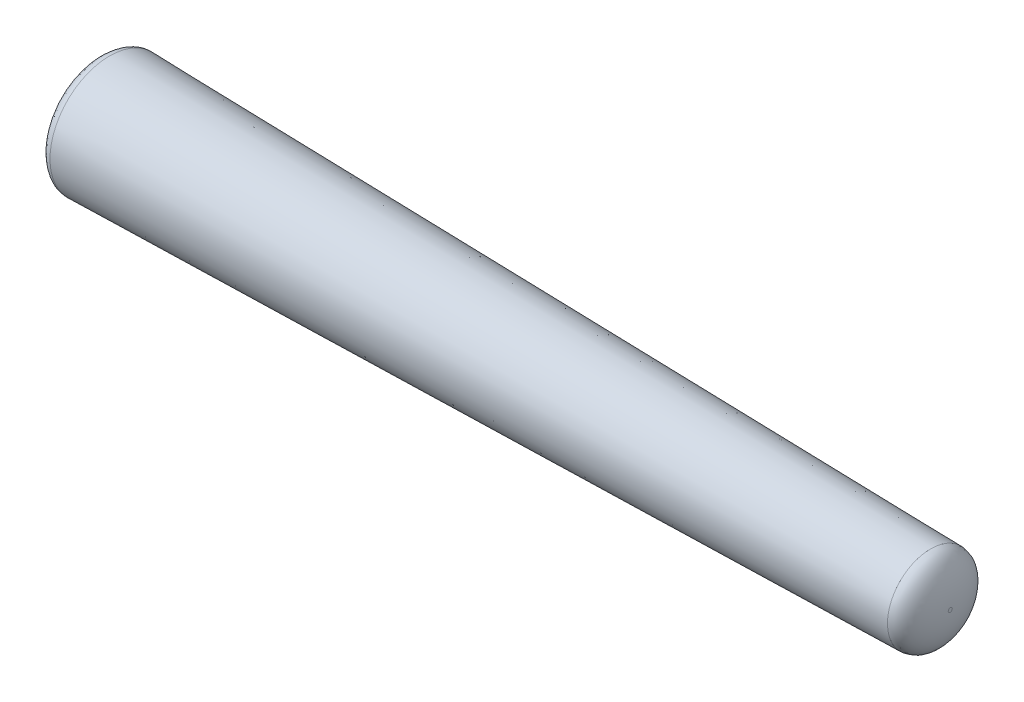
ISO-10303-21;
HEADER;
FILE_DESCRIPTION(('STEP AP214'),'2;1');
FILE_NAME('part.step','',(''),(''),'','','');
FILE_SCHEMA(('AUTOMOTIVE_DESIGN { 1 0 10303 214 1 1 1 1 }'));
ENDSEC;
DATA;
#1=APPLICATION_CONTEXT('core data for automotive mechanical design processes');
#2=APPLICATION_PROTOCOL_DEFINITION('international standard','automotive_design',2000,#1);
#3=PRODUCT_CONTEXT('',#1,'mechanical');
#4=PRODUCT('Part','Part','',(#3));
#5=PRODUCT_RELATED_PRODUCT_CATEGORY('part','',(#4));
#6=PRODUCT_DEFINITION_FORMATION('','',#4);
#7=PRODUCT_DEFINITION_CONTEXT('part definition',#1,'design');
#8=PRODUCT_DEFINITION('design','',#6,#7);
#9=PRODUCT_DEFINITION_SHAPE('','',#8);
#10=(LENGTH_UNIT() NAMED_UNIT(*) SI_UNIT(.MILLI.,.METRE.));
#11=(NAMED_UNIT(*) PLANE_ANGLE_UNIT() SI_UNIT($,.RADIAN.));
#12=(NAMED_UNIT(*) SI_UNIT($,.STERADIAN.) SOLID_ANGLE_UNIT());
#13=UNCERTAINTY_MEASURE_WITH_UNIT(LENGTH_MEASURE(1.E-05),#10,'distance_accuracy_value','');
#14=(GEOMETRIC_REPRESENTATION_CONTEXT(3) GLOBAL_UNCERTAINTY_ASSIGNED_CONTEXT((#13)) GLOBAL_UNIT_ASSIGNED_CONTEXT((#10,
#11,#12)) REPRESENTATION_CONTEXT('',''));
#15=CARTESIAN_POINT('',(0.,0.,0.));
#16=DIRECTION('',(0.,0.,1.));
#17=DIRECTION('',(1.,0.,0.));
#18=AXIS2_PLACEMENT_3D('',#15,#16,#17);
#19=CARTESIAN_POINT('',(0.,0.,0.));
#20=DIRECTION('',(-1.,0.,0.));
#21=DIRECTION('',(0.,0.,-1.));
#22=AXIS2_PLACEMENT_3D('',#19,#20,#21);
#23=CONICAL_SURFACE('',#22,2.5,0.0200712863979348);
#24=CARTESIAN_POINT('',(20.0401398775672,0.,-2.09771459050936));
#25=CARTESIAN_POINT('',(20.0401398775672,0.274585444005414,-2.09771459050936));
#26=CARTESIAN_POINT('',(20.0401398775672,0.549076747976326,-2.04311487541138));
#27=CARTESIAN_POINT('',(20.0401398775672,1.05644449126058,-1.83295627503241));
#28=CARTESIAN_POINT('',(20.0401398775672,1.28914698247178,-1.67746944141448));
#29=CARTESIAN_POINT('',(20.0401398775672,1.67746944141448,-1.28914698247178));
#30=CARTESIAN_POINT('',(20.0401398775672,1.83295627503241,-1.05644449126058));
#31=CARTESIAN_POINT('',(20.0401398775672,2.04311487541138,-0.549076747976324));
#32=CARTESIAN_POINT('',(20.0401398775672,2.09771459050936,-0.274585444005414));
#33=CARTESIAN_POINT('',(20.0401398775672,2.09771459050936,0.274585444005414));
#34=CARTESIAN_POINT('',(20.0401398775672,2.04311487541138,0.549076747976327));
#35=CARTESIAN_POINT('',(20.0401398775672,1.83295627503241,1.05644449126058));
#36=CARTESIAN_POINT('',(20.0401398775672,1.67746944141448,1.28914698247179));
#37=CARTESIAN_POINT('',(20.0401398775672,1.28914698247178,1.67746944141448));
#38=CARTESIAN_POINT('',(20.0401398775672,1.05644449126058,1.83295627503241));
#39=CARTESIAN_POINT('',(20.0401398775672,0.549076747976328,2.04311487541138));
#40=CARTESIAN_POINT('',(20.0401398775672,0.274585444005414,2.09771459050936));
#41=CARTESIAN_POINT('',(20.0401398775672,-0.274585444005414,2.09771459050936));
#42=CARTESIAN_POINT('',(20.0401398775672,-0.549076747976324,2.04311487541138));
#43=CARTESIAN_POINT('',(20.0401398775672,-1.05644449126057,1.83295627503241));
#44=CARTESIAN_POINT('',(20.0401398775672,-1.28914698247179,1.67746944141448));
#45=CARTESIAN_POINT('',(20.0401398775672,-1.67746944141448,1.28914698247178));
#46=CARTESIAN_POINT('',(20.0401398775672,-1.83295627503241,1.05644449126058));
#47=CARTESIAN_POINT('',(20.0401398775672,-2.04311487541138,0.54907674797633));
#48=CARTESIAN_POINT('',(20.0401398775672,-2.09771459050936,0.274585444005411));
#49=CARTESIAN_POINT('',(20.0401398775672,-2.09771459050936,-0.274585444005418));
#50=CARTESIAN_POINT('',(20.0401398775672,-2.04311487541138,-0.549076747976322));
#51=CARTESIAN_POINT('',(20.0401398775672,-1.83295627503241,-1.05644449126057));
#52=CARTESIAN_POINT('',(20.0401398775672,-1.67746944141448,-1.28914698247178));
#53=CARTESIAN_POINT('',(20.0401398775672,-1.28914698247179,-1.67746944141447));
#54=CARTESIAN_POINT('',(20.0401398775672,-1.05644449126058,-1.83295627503241));
#55=CARTESIAN_POINT('',(20.0401398775672,-0.549076747976329,-2.04311487541138));
#56=CARTESIAN_POINT('',(20.0401398775672,-0.274585444005414,-2.09771459050936));
#57=CARTESIAN_POINT('',(20.0401398775672,0.,-2.09771459050936));
#58=(BOUNDED_CURVE() B_SPLINE_CURVE(3,(#24,#25,#26,#27,#28,#29,#30,#31,#32,#33,#34,#35,#36,#37,
#38,#39,#40,#41,#42,#43,#44,#45,#46,#47,#48,#49,#50,#51,#52,#53,#54,#55,#56,#57),.UNSPECIFIED.,
.T.,.F.) B_SPLINE_CURVE_WITH_KNOTS((4,2,2,2,2,2,2,2,2,2,2,2,2,2,2,2,4),(0.,0.392699081698724,
0.785398163397448,1.17809724509617,1.5707963267949,1.96349540849362,2.35619449019234,
2.74889357189107,3.14159265358979,3.53429173528852,3.92699081698724,4.31968989868597,
4.71238898038469,5.10508806208341,5.49778714378214,5.89048622548086,6.28318530717959),
.UNSPECIFIED.) CURVE() GEOMETRIC_REPRESENTATION_ITEM() RATIONAL_B_SPLINE_CURVE((1.,1.,1.,1.,1.,
1.,1.,1.,1.,1.,1.,1.,1.,1.,1.,1.,1.,1.,1.,1.,1.,1.,1.,1.,1.,1.,1.,1.,1.,1.,1.,1.,1.,1.)) REPRESENTATION_ITEM(''));
#59=CARTESIAN_POINT('',(20.0401398775672,0.,-2.09771459050936));
#60=VERTEX_POINT('',#59);
#61=EDGE_CURVE('E11',#60,#60,#58,.F.);
#62=ORIENTED_EDGE('',*,*,#61,.T.);
#63=EDGE_LOOP('',(#62));
#64=FACE_BOUND('',#63,.T.);
#65=CARTESIAN_POINT('',(-19.943804171406,0.,-2.90035156824809));
#66=CARTESIAN_POINT('',(-19.943804171406,-0.379648919222035,-2.90035156824809));
#67=CARTESIAN_POINT('',(-19.943804171406,-0.759166627193389,-2.82486080249301));
#68=CARTESIAN_POINT('',(-19.943804171406,-1.46066635921192,-2.53429009948984));
#69=CARTESIAN_POINT('',(-19.943804171406,-1.78240593648123,-2.3193105869853));
#70=CARTESIAN_POINT('',(-19.943804171406,-2.31931058698531,-1.78240593648122));
#71=CARTESIAN_POINT('',(-19.943804171406,-2.53429009948984,-1.46066635921191));
#72=CARTESIAN_POINT('',(-19.943804171406,-2.82486080249301,-0.759166627193382));
#73=CARTESIAN_POINT('',(-19.943804171406,-2.90035156824809,-0.379648919222035));
#74=CARTESIAN_POINT('',(-19.943804171406,-2.90035156824809,0.379648919222026));
#75=CARTESIAN_POINT('',(-19.943804171406,-2.82486080249301,0.75916662719339));
#76=CARTESIAN_POINT('',(-19.943804171406,-2.53429009948984,1.46066635921192));
#77=CARTESIAN_POINT('',(-19.943804171406,-2.3193105869853,1.78240593648122));
#78=CARTESIAN_POINT('',(-19.943804171406,-1.78240593648123,2.3193105869853));
#79=CARTESIAN_POINT('',(-19.943804171406,-1.46066635921191,2.53429009948984));
#80=CARTESIAN_POINT('',(-19.943804171406,-0.759166627193381,2.82486080249301));
#81=CARTESIAN_POINT('',(-19.943804171406,-0.37964891922203,2.90035156824809));
#82=CARTESIAN_POINT('',(-19.943804171406,0.37964891922203,2.90035156824809));
#83=CARTESIAN_POINT('',(-19.943804171406,0.759166627193389,2.82486080249301));
#84=CARTESIAN_POINT('',(-19.943804171406,1.46066635921192,2.53429009948984));
#85=CARTESIAN_POINT('',(-19.943804171406,1.78240593648122,2.3193105869853));
#86=CARTESIAN_POINT('',(-19.943804171406,2.3193105869853,1.78240593648123));
#87=CARTESIAN_POINT('',(-19.943804171406,2.53429009948984,1.46066635921192));
#88=CARTESIAN_POINT('',(-19.943804171406,2.82486080249301,0.759166627193388));
#89=CARTESIAN_POINT('',(-19.943804171406,2.90035156824809,0.37964891922203));
#90=CARTESIAN_POINT('',(-19.943804171406,2.90035156824809,-0.37964891922203));
#91=CARTESIAN_POINT('',(-19.943804171406,2.82486080249301,-0.759166627193384));
#92=CARTESIAN_POINT('',(-19.943804171406,2.53429009948984,-1.46066635921191));
#93=CARTESIAN_POINT('',(-19.943804171406,2.31931058698531,-1.78240593648122));
#94=CARTESIAN_POINT('',(-19.943804171406,1.78240593648122,-2.31931058698531));
#95=CARTESIAN_POINT('',(-19.943804171406,1.46066635921192,-2.53429009948984));
#96=CARTESIAN_POINT('',(-19.943804171406,0.759166627193385,-2.82486080249301));
#97=CARTESIAN_POINT('',(-19.943804171406,0.379648919222035,-2.90035156824809));
#98=CARTESIAN_POINT('',(-19.943804171406,0.,-2.90035156824809));
#99=(BOUNDED_CURVE() B_SPLINE_CURVE(3,(#65,#66,#67,#68,#69,#70,#71,#72,#73,#74,#75,#76,#77,#78,
#79,#80,#81,#82,#83,#84,#85,#86,#87,#88,#89,#90,#91,#92,#93,#94,#95,#96,#97,#98),.UNSPECIFIED.,
.T.,.F.) B_SPLINE_CURVE_WITH_KNOTS((4,2,2,2,2,2,2,2,2,2,2,2,2,2,2,2,4),(0.,0.392699081698725,
0.785398163397448,1.17809724509617,1.5707963267949,1.96349540849362,2.35619449019234,
2.74889357189107,3.14159265358979,3.53429173528852,3.92699081698724,4.31968989868597,
4.71238898038469,5.10508806208341,5.49778714378214,5.89048622548086,6.28318530717959),
.UNSPECIFIED.) CURVE() GEOMETRIC_REPRESENTATION_ITEM() RATIONAL_B_SPLINE_CURVE((1.,1.,1.,1.,1.,
1.,1.,1.,1.,1.,1.,1.,1.,1.,1.,1.,1.,1.,1.,1.,1.,1.,1.,1.,1.,1.,1.,1.,1.,1.,1.,1.,1.,1.)) REPRESENTATION_ITEM(''));
#100=CARTESIAN_POINT('',(-19.943804171406,0.,-2.90035156824809));
#101=VERTEX_POINT('',#100);
#102=EDGE_CURVE('E59',#101,#101,#99,.F.);
#103=ORIENTED_EDGE('',*,*,#102,.T.);
#104=EDGE_LOOP('',(#103));
#105=FACE_BOUND('',#104,.T.);
#106=ADVANCED_FACE('F36',(#64,#105),#23,.T.);
#107=CARTESIAN_POINT('',(-21.,0.,0.));
#108=DIRECTION('',(1.,0.,0.));
#109=DIRECTION('',(0.,0.,-1.));
#110=AXIS2_PLACEMENT_3D('',#107,#108,#109);
#111=PLANE('',#110);
#112=CARTESIAN_POINT('',(-21.,0.,-0.100915548466853));
#113=CARTESIAN_POINT('',(-21.,0.0132095982182193,-0.100915548466853));
#114=CARTESIAN_POINT('',(-21.,0.0264146310397905,-0.0982889041269878));
#115=CARTESIAN_POINT('',(-21.,0.050822785892811,-0.0881787153543641));
#116=CARTESIAN_POINT('',(-21.,0.0620174721712188,-0.0806986651249236));
#117=CARTESIAN_POINT('',(-21.,0.0806986651249236,-0.0620174721712188));
#118=CARTESIAN_POINT('',(-21.,0.0881787153543641,-0.0508227858928109));
#119=CARTESIAN_POINT('',(-21.,0.0982889041269878,-0.0264146310397905));
#120=CARTESIAN_POINT('',(-21.,0.100915548466853,-0.0132095982182191));
#121=CARTESIAN_POINT('',(-21.,0.100915548466853,0.0132095982182191));
#122=CARTESIAN_POINT('',(-21.,0.0982889041269878,0.0264146310397906));
#123=CARTESIAN_POINT('',(-21.,0.0881787153543641,0.0508227858928109));
#124=CARTESIAN_POINT('',(-21.,0.0806986651249236,0.0620174721712189));
#125=CARTESIAN_POINT('',(-21.,0.0620174721712187,0.0806986651249236));
#126=CARTESIAN_POINT('',(-21.,0.0508227858928111,0.088178715354364));
#127=CARTESIAN_POINT('',(-21.,0.0264146310397907,0.0982889041269877));
#128=CARTESIAN_POINT('',(-21.,0.0132095982182191,0.100915548466853));
#129=CARTESIAN_POINT('',(-21.,-0.0132095982182191,0.100915548466853));
#130=CARTESIAN_POINT('',(-21.,-0.0264146310397904,0.0982889041269878));
#131=CARTESIAN_POINT('',(-21.,-0.0508227858928108,0.0881787153543641));
#132=CARTESIAN_POINT('',(-21.,-0.0620174721712188,0.0806986651249236));
#133=CARTESIAN_POINT('',(-21.,-0.0806986651249237,0.0620174721712187));
#134=CARTESIAN_POINT('',(-21.,-0.0881787153543639,0.050822785892811));
#135=CARTESIAN_POINT('',(-21.,-0.0982889041269878,0.0264146310397907));
#136=CARTESIAN_POINT('',(-21.,-0.100915548466853,0.013209598218219));
#137=CARTESIAN_POINT('',(-21.,-0.100915548466853,-0.0132095982182193));
#138=CARTESIAN_POINT('',(-21.,-0.0982889041269878,-0.0264146310397904));
#139=CARTESIAN_POINT('',(-21.,-0.0881787153543641,-0.0508227858928108));
#140=CARTESIAN_POINT('',(-21.,-0.0806986651249237,-0.0620174721712185));
#141=CARTESIAN_POINT('',(-21.,-0.0620174721712191,-0.0806986651249234));
#142=CARTESIAN_POINT('',(-21.,-0.050822785892811,-0.088178715354364));
#143=CARTESIAN_POINT('',(-21.,-0.0264146310397907,-0.0982889041269877));
#144=CARTESIAN_POINT('',(-21.,-0.0132095982182193,-0.100915548466853));
#145=CARTESIAN_POINT('',(-21.,0.,-0.100915548466853));
#146=(BOUNDED_CURVE() B_SPLINE_CURVE(3,(#112,#113,#114,#115,#116,#117,#118,#119,#120,#121,#122,
#123,#124,#125,#126,#127,#128,#129,#130,#131,#132,#133,#134,#135,#136,#137,#138,#139,#140,#141,
#142,#143,#144,#145),.UNSPECIFIED.,.T.,.F.) B_SPLINE_CURVE_WITH_KNOTS((4,2,2,2,2,2,2,2,2,2,2,2,
2,2,2,2,4),(0.,0.392699081698724,0.785398163397448,1.17809724509617,1.5707963267949,
1.96349540849362,2.35619449019234,2.74889357189107,3.14159265358979,3.53429173528852,
3.92699081698724,4.31968989868597,4.71238898038469,5.10508806208341,5.49778714378214,
5.89048622548086,6.28318530717959),
.UNSPECIFIED.) CURVE() GEOMETRIC_REPRESENTATION_ITEM() RATIONAL_B_SPLINE_CURVE((1.,1.,1.,1.,1.,
1.,1.,1.,1.,1.,1.,1.,1.,1.,1.,1.,1.,1.,1.,1.,1.,1.,1.,1.,1.,1.,1.,1.,1.,1.,1.,1.,1.,1.)) REPRESENTATION_ITEM(''));
#147=CARTESIAN_POINT('',(-21.,0.,-0.100915548466853));
#148=VERTEX_POINT('',#147);
#149=EDGE_CURVE('E54',#148,#148,#146,.F.);
#150=ORIENTED_EDGE('',*,*,#149,.T.);
#151=EDGE_LOOP('',(#150));
#152=FACE_BOUND('',#151,.T.);
#153=ADVANCED_FACE('F82',(#152),#111,.F.);
#154=CARTESIAN_POINT('',(21.,0.,0.));
#155=DIRECTION('',(1.,0.,0.));
#156=DIRECTION('',(0.,0.,-1.));
#157=AXIS2_PLACEMENT_3D('',#154,#155,#156);
#158=PLANE('',#157);
#159=CARTESIAN_POINT('',(21.,0.,-0.0981174335227618));
#160=CARTESIAN_POINT('',(21.,-0.012843319663414,-0.0981174335227618));
#161=CARTESIAN_POINT('',(21.,-0.0256822360688163,-0.0955636142659737));
#162=CARTESIAN_POINT('',(21.,-0.049413596401872,-0.085733762962459));
#163=CARTESIAN_POINT('',(21.,-0.0602979041696189,-0.0784611010235114));
#164=CARTESIAN_POINT('',(21.,-0.0784611010235117,-0.0602979041696184));
#165=CARTESIAN_POINT('',(21.,-0.0857337629624592,-0.0494135964018717));
#166=CARTESIAN_POINT('',(21.,-0.0955636142659737,-0.0256822360688159));
#167=CARTESIAN_POINT('',(21.,-0.0981174335227618,-0.0128433196634141));
#168=CARTESIAN_POINT('',(21.,-0.0981174335227618,0.0128433196634138));
#169=CARTESIAN_POINT('',(21.,-0.0955636142659736,0.0256822360688163));
#170=CARTESIAN_POINT('',(21.,-0.0857337629624591,0.049413596401872));
#171=CARTESIAN_POINT('',(21.,-0.0784611010235117,0.0602979041696186));
#172=CARTESIAN_POINT('',(21.,-0.0602979041696186,0.0784611010235115));
#173=CARTESIAN_POINT('',(21.,-0.0494135964018717,0.0857337629624592));
#174=CARTESIAN_POINT('',(21.,-0.025682236068816,0.0955636142659737));
#175=CARTESIAN_POINT('',(21.,-0.0128433196634139,0.0981174335227618));
#176=CARTESIAN_POINT('',(21.,0.012843319663414,0.0981174335227618));
#177=CARTESIAN_POINT('',(21.,0.0256822360688162,0.0955636142659736));
#178=CARTESIAN_POINT('',(21.,0.049413596401872,0.085733762962459));
#179=CARTESIAN_POINT('',(21.,0.0602979041696185,0.0784611010235116));
#180=CARTESIAN_POINT('',(21.,0.0784611010235116,0.0602979041696187));
#181=CARTESIAN_POINT('',(21.,0.085733762962459,0.0494135964018719));
#182=CARTESIAN_POINT('',(21.,0.0955636142659737,0.0256822360688161));
#183=CARTESIAN_POINT('',(21.,0.0981174335227618,0.0128433196634139));
#184=CARTESIAN_POINT('',(21.,0.0981174335227618,-0.012843319663414));
#185=CARTESIAN_POINT('',(21.,0.0955636142659737,-0.025682236068816));
#186=CARTESIAN_POINT('',(21.,0.0857337629624592,-0.0494135964018719));
#187=CARTESIAN_POINT('',(21.,0.0784611010235118,-0.0602979041696185));
#188=CARTESIAN_POINT('',(21.,0.0602979041696185,-0.0784611010235118));
#189=CARTESIAN_POINT('',(21.,0.0494135964018719,-0.0857337629624591));
#190=CARTESIAN_POINT('',(21.,0.0256822360688161,-0.0955636142659737));
#191=CARTESIAN_POINT('',(21.,0.012843319663414,-0.0981174335227618));
#192=CARTESIAN_POINT('',(21.,0.,-0.0981174335227618));
#193=(BOUNDED_CURVE() B_SPLINE_CURVE(3,(#159,#160,#161,#162,#163,#164,#165,#166,#167,#168,#169,
#170,#171,#172,#173,#174,#175,#176,#177,#178,#179,#180,#181,#182,#183,#184,#185,#186,#187,#188,
#189,#190,#191,#192),.UNSPECIFIED.,.T.,.F.) B_SPLINE_CURVE_WITH_KNOTS((4,2,2,2,2,2,2,2,2,2,2,2,
2,2,2,2,4),(0.,0.392699081698725,0.785398163397448,1.17809724509617,1.5707963267949,
1.96349540849362,2.35619449019234,2.74889357189107,3.14159265358979,3.53429173528852,
3.92699081698724,4.31968989868597,4.71238898038469,5.10508806208341,5.49778714378214,
5.89048622548086,6.28318530717959),
.UNSPECIFIED.) CURVE() GEOMETRIC_REPRESENTATION_ITEM() RATIONAL_B_SPLINE_CURVE((1.,1.,1.,1.,1.,
1.,1.,1.,1.,1.,1.,1.,1.,1.,1.,1.,1.,1.,1.,1.,1.,1.,1.,1.,1.,1.,1.,1.,1.,1.,1.,1.,1.,1.)) REPRESENTATION_ITEM(''));
#194=CARTESIAN_POINT('',(21.,0.,-0.0981174335227618));
#195=VERTEX_POINT('',#194);
#196=EDGE_CURVE('E49',#195,#195,#193,.F.);
#197=ORIENTED_EDGE('',*,*,#196,.T.);
#198=EDGE_LOOP('',(#197));
#199=FACE_BOUND('',#198,.T.);
#200=ADVANCED_FACE('F115',(#199),#158,.T.);
#201=CARTESIAN_POINT('',(-19.943804171406,0.,-2.90035156824809));
#202=CARTESIAN_POINT('',(-19.943804171406,0.379648919222035,-2.90035156824809));
#203=CARTESIAN_POINT('',(-19.943804171406,0.759166627193385,-2.82486080249301));
#204=CARTESIAN_POINT('',(-19.943804171406,1.46066635921192,-2.53429009948984));
#205=CARTESIAN_POINT('',(-19.943804171406,1.78240593648122,-2.31931058698531));
#206=CARTESIAN_POINT('',(-19.943804171406,2.31931058698531,-1.78240593648122));
#207=CARTESIAN_POINT('',(-19.943804171406,2.53429009948984,-1.46066635921191));
#208=CARTESIAN_POINT('',(-19.943804171406,2.82486080249301,-0.759166627193384));
#209=CARTESIAN_POINT('',(-19.943804171406,2.90035156824809,-0.37964891922203));
#210=CARTESIAN_POINT('',(-19.943804171406,2.90035156824809,0.37964891922203));
#211=CARTESIAN_POINT('',(-19.943804171406,2.82486080249301,0.759166627193388));
#212=CARTESIAN_POINT('',(-19.943804171406,2.53429009948984,1.46066635921192));
#213=CARTESIAN_POINT('',(-19.943804171406,2.3193105869853,1.78240593648123));
#214=CARTESIAN_POINT('',(-19.943804171406,1.78240593648122,2.3193105869853));
#215=CARTESIAN_POINT('',(-19.943804171406,1.46066635921192,2.53429009948984));
#216=CARTESIAN_POINT('',(-19.943804171406,0.759166627193389,2.82486080249301));
#217=CARTESIAN_POINT('',(-19.943804171406,0.37964891922203,2.90035156824809));
#218=CARTESIAN_POINT('',(-19.943804171406,-0.37964891922203,2.90035156824809));
#219=CARTESIAN_POINT('',(-19.943804171406,-0.759166627193381,2.82486080249301));
#220=CARTESIAN_POINT('',(-19.943804171406,-1.46066635921191,2.53429009948984));
#221=CARTESIAN_POINT('',(-19.943804171406,-1.78240593648123,2.3193105869853));
#222=CARTESIAN_POINT('',(-19.943804171406,-2.3193105869853,1.78240593648122));
#223=CARTESIAN_POINT('',(-19.943804171406,-2.53429009948984,1.46066635921192));
#224=CARTESIAN_POINT('',(-19.943804171406,-2.82486080249301,0.75916662719339));
#225=CARTESIAN_POINT('',(-19.943804171406,-2.90035156824809,0.379648919222026));
#226=CARTESIAN_POINT('',(-19.943804171406,-2.90035156824809,-0.379648919222035));
#227=CARTESIAN_POINT('',(-19.943804171406,-2.82486080249301,-0.759166627193382));
#228=CARTESIAN_POINT('',(-19.943804171406,-2.53429009948984,-1.46066635921191));
#229=CARTESIAN_POINT('',(-19.943804171406,-2.31931058698531,-1.78240593648122));
#230=CARTESIAN_POINT('',(-19.943804171406,-1.78240593648123,-2.3193105869853));
#231=CARTESIAN_POINT('',(-19.943804171406,-1.46066635921192,-2.53429009948984));
#232=CARTESIAN_POINT('',(-19.943804171406,-0.759166627193389,-2.82486080249301));
#233=CARTESIAN_POINT('',(-19.943804171406,-0.379648919222035,-2.90035156824809));
#234=CARTESIAN_POINT('',(-19.943804171406,0.,-2.90035156824809));
#235=CARTESIAN_POINT('',(-21.,0.,-2.92155362442156));
#236=CARTESIAN_POINT('',(-21.,0.382424216465191,-2.92155362442156));
#237=CARTESIAN_POINT('',(-21.,0.764716262503455,-2.84551100851367));
#238=CARTESIAN_POINT('',(-21.,1.47134407516116,-2.55281618496082));
#239=CARTESIAN_POINT('',(-21.,1.79543562267613,-2.3362651361811));
#240=CARTESIAN_POINT('',(-21.,2.33626513618111,-1.79543562267613));
#241=CARTESIAN_POINT('',(-21.,2.55281618496082,-1.47134407516116));
#242=CARTESIAN_POINT('',(-21.,2.84551100851367,-0.764716262503456));
#243=CARTESIAN_POINT('',(-21.,2.92155362442155,-0.382424216465186));
#244=CARTESIAN_POINT('',(-21.,2.92155362442156,0.382424216465185));
#245=CARTESIAN_POINT('',(-21.,2.84551100851367,0.764716262503459));
#246=CARTESIAN_POINT('',(-21.,2.55281618496082,1.47134407516116));
#247=CARTESIAN_POINT('',(-21.,2.3362651361811,1.79543562267614));
#248=CARTESIAN_POINT('',(-21.,1.79543562267614,2.3362651361811));
#249=CARTESIAN_POINT('',(-21.,1.47134407516116,2.55281618496081));
#250=CARTESIAN_POINT('',(-21.,0.764716262503463,2.84551100851367));
#251=CARTESIAN_POINT('',(-21.,0.382424216465186,2.92155362442156));
#252=CARTESIAN_POINT('',(-21.,-0.382424216465185,2.92155362442156));
#253=CARTESIAN_POINT('',(-21.,-0.76471626250345,2.84551100851366));
#254=CARTESIAN_POINT('',(-21.,-1.47134407516116,2.55281618496083));
#255=CARTESIAN_POINT('',(-21.,-1.79543562267614,2.3362651361811));
#256=CARTESIAN_POINT('',(-21.,-2.3362651361811,1.79543562267614));
#257=CARTESIAN_POINT('',(-21.,-2.55281618496081,1.47134407516117));
#258=CARTESIAN_POINT('',(-21.,-2.84551100851367,0.764716262503462));
#259=CARTESIAN_POINT('',(-21.,-2.92155362442156,0.382424216465181));
#260=CARTESIAN_POINT('',(-21.,-2.92155362442155,-0.38242421646519));
#261=CARTESIAN_POINT('',(-21.,-2.84551100851368,-0.764716262503457));
#262=CARTESIAN_POINT('',(-21.,-2.55281618496081,-1.47134407516115));
#263=CARTESIAN_POINT('',(-21.,-2.3362651361811,-1.79543562267612));
#264=CARTESIAN_POINT('',(-21.,-1.79543562267615,-2.3362651361811));
#265=CARTESIAN_POINT('',(-21.,-1.47134407516116,-2.55281618496081));
#266=CARTESIAN_POINT('',(-21.,-0.764716262503464,-2.84551100851368));
#267=CARTESIAN_POINT('',(-21.,-0.382424216465191,-2.92155362442156));
#268=CARTESIAN_POINT('',(-21.,0.,-2.92155362442156));
#269=CARTESIAN_POINT('',(-21.,0.,-0.100915548466853));
#270=CARTESIAN_POINT('',(-21.,0.0132095982182193,-0.100915548466853));
#271=CARTESIAN_POINT('',(-21.,0.0264146310397905,-0.0982889041269878));
#272=CARTESIAN_POINT('',(-21.,0.050822785892811,-0.0881787153543641));
#273=CARTESIAN_POINT('',(-21.,0.0620174721712188,-0.0806986651249236));
#274=CARTESIAN_POINT('',(-21.,0.0806986651249236,-0.0620174721712188));
#275=CARTESIAN_POINT('',(-21.,0.0881787153543641,-0.0508227858928109));
#276=CARTESIAN_POINT('',(-21.,0.0982889041269878,-0.0264146310397905));
#277=CARTESIAN_POINT('',(-21.,0.100915548466853,-0.0132095982182191));
#278=CARTESIAN_POINT('',(-21.,0.100915548466853,0.0132095982182191));
#279=CARTESIAN_POINT('',(-21.,0.0982889041269878,0.0264146310397906));
#280=CARTESIAN_POINT('',(-21.,0.0881787153543641,0.0508227858928109));
#281=CARTESIAN_POINT('',(-21.,0.0806986651249236,0.0620174721712189));
#282=CARTESIAN_POINT('',(-21.,0.0620174721712187,0.0806986651249236));
#283=CARTESIAN_POINT('',(-21.,0.0508227858928111,0.088178715354364));
#284=CARTESIAN_POINT('',(-21.,0.0264146310397907,0.0982889041269877));
#285=CARTESIAN_POINT('',(-21.,0.0132095982182191,0.100915548466853));
#286=CARTESIAN_POINT('',(-21.,-0.0132095982182191,0.100915548466853));
#287=CARTESIAN_POINT('',(-21.,-0.0264146310397904,0.0982889041269878));
#288=CARTESIAN_POINT('',(-21.,-0.0508227858928108,0.0881787153543641));
#289=CARTESIAN_POINT('',(-21.,-0.0620174721712188,0.0806986651249236));
#290=CARTESIAN_POINT('',(-21.,-0.0806986651249237,0.0620174721712187));
#291=CARTESIAN_POINT('',(-21.,-0.0881787153543639,0.050822785892811));
#292=CARTESIAN_POINT('',(-21.,-0.0982889041269878,0.0264146310397907));
#293=CARTESIAN_POINT('',(-21.,-0.100915548466853,0.013209598218219));
#294=CARTESIAN_POINT('',(-21.,-0.100915548466853,-0.0132095982182193));
#295=CARTESIAN_POINT('',(-21.,-0.0982889041269878,-0.0264146310397904));
#296=CARTESIAN_POINT('',(-21.,-0.0881787153543641,-0.0508227858928108));
#297=CARTESIAN_POINT('',(-21.,-0.0806986651249237,-0.0620174721712185));
#298=CARTESIAN_POINT('',(-21.,-0.0620174721712191,-0.0806986651249234));
#299=CARTESIAN_POINT('',(-21.,-0.050822785892811,-0.088178715354364));
#300=CARTESIAN_POINT('',(-21.,-0.0264146310397907,-0.0982889041269877));
#301=CARTESIAN_POINT('',(-21.,-0.0132095982182193,-0.100915548466853));
#302=CARTESIAN_POINT('',(-21.,0.,-0.100915548466853));
#303=(BOUNDED_SURFACE() B_SPLINE_SURFACE(2,3,((#201,#202,#203,#204,#205,#206,#207,#208,#209,
#210,#211,#212,#213,#214,#215,#216,#217,#218,#219,#220,#221,#222,#223,#224,#225,#226,#227,#228,
#229,#230,#231,#232,#233,#234),(#235,#236,#237,#238,#239,#240,#241,#242,#243,#244,#245,#246,
#247,#248,#249,#250,#251,#252,#253,#254,#255,#256,#257,#258,#259,#260,#261,#262,#263,#264,#265,
#266,#267,#268),(#269,#270,#271,#272,#273,#274,#275,#276,#277,#278,#279,#280,#281,#282,#283,
#284,#285,#286,#287,#288,#289,#290,#291,#292,#293,#294,#295,#296,#297,#298,#299,#300,#301,
#302)),.UNSPECIFIED.,.F.,.T.,.F.) B_SPLINE_SURFACE_WITH_KNOTS((3,3),(4,2,2,2,2,2,2,2,2,2,2,2,2,
2,2,2,4),(0.,1.),(0.,0.392699081698724,0.785398163397448,1.17809724509617,1.5707963267949,
1.96349540849362,2.35619449019234,2.74889357189107,3.14159265358979,3.53429173528852,
3.92699081698724,4.31968989868597,4.71238898038469,5.10508806208341,5.49778714378214,
5.89048622548086,6.28318530717959),
.UNSPECIFIED.) GEOMETRIC_REPRESENTATION_ITEM() RATIONAL_B_SPLINE_SURFACE(((1.,1.,1.,1.,1.,1.,1.,
1.,1.,1.,1.,1.,1.,1.,1.,1.,1.,1.,1.,1.,1.,1.,1.,1.,1.,1.,1.,1.,1.,1.,1.,1.,1.,1.),
(0.69997502141734,0.69997502141734,0.69997502141734,0.69997502141734,0.69997502141734,
0.69997502141734,0.69997502141734,0.69997502141734,0.69997502141734,0.69997502141734,
0.69997502141734,0.69997502141734,0.69997502141734,0.69997502141734,0.69997502141734,
0.69997502141734,0.69997502141734,0.69997502141734,0.69997502141734,0.69997502141734,
0.69997502141734,0.69997502141734,0.69997502141734,0.69997502141734,0.69997502141734,
0.69997502141734,0.69997502141734,0.69997502141734,0.69997502141734,0.69997502141734,
0.69997502141734,0.69997502141734,0.69997502141734,0.69997502141734),(1.,1.,1.,1.,1.,1.,1.,1.,
1.,1.,1.,1.,1.,1.,1.,1.,1.,1.,1.,1.,1.,1.,1.,1.,1.,1.,1.,1.,1.,1.,1.,1.,1.,1.))) REPRESENTATION_ITEM('') SURFACE());
#304=ORIENTED_EDGE('',*,*,#149,.F.);
#305=EDGE_LOOP('',(#304));
#306=FACE_BOUND('',#305,.T.);
#307=ORIENTED_EDGE('',*,*,#102,.F.);
#308=EDGE_LOOP('',(#307));
#309=FACE_BOUND('',#308,.T.);
#310=ADVANCED_FACE('F86',(#306,#309),#303,.T.);
#311=CARTESIAN_POINT('',(21.,0.,-0.0981174335227618));
#312=CARTESIAN_POINT('',(21.,0.012843319663414,-0.0981174335227618));
#313=CARTESIAN_POINT('',(21.,0.0256822360688161,-0.0955636142659737));
#314=CARTESIAN_POINT('',(21.,0.0494135964018719,-0.0857337629624591));
#315=CARTESIAN_POINT('',(21.,0.0602979041696185,-0.0784611010235118));
#316=CARTESIAN_POINT('',(21.,0.0784611010235118,-0.0602979041696185));
#317=CARTESIAN_POINT('',(21.,0.0857337629624592,-0.0494135964018719));
#318=CARTESIAN_POINT('',(21.,0.0955636142659737,-0.025682236068816));
#319=CARTESIAN_POINT('',(21.,0.0981174335227618,-0.012843319663414));
#320=CARTESIAN_POINT('',(21.,0.0981174335227618,0.0128433196634139));
#321=CARTESIAN_POINT('',(21.,0.0955636142659737,0.0256822360688161));
#322=CARTESIAN_POINT('',(21.,0.085733762962459,0.0494135964018719));
#323=CARTESIAN_POINT('',(21.,0.0784611010235116,0.0602979041696187));
#324=CARTESIAN_POINT('',(21.,0.0602979041696185,0.0784611010235116));
#325=CARTESIAN_POINT('',(21.,0.049413596401872,0.085733762962459));
#326=CARTESIAN_POINT('',(21.,0.0256822360688162,0.0955636142659736));
#327=CARTESIAN_POINT('',(21.,0.012843319663414,0.0981174335227618));
#328=CARTESIAN_POINT('',(21.,-0.0128433196634139,0.0981174335227618));
#329=CARTESIAN_POINT('',(21.,-0.025682236068816,0.0955636142659737));
#330=CARTESIAN_POINT('',(21.,-0.0494135964018717,0.0857337629624592));
#331=CARTESIAN_POINT('',(21.,-0.0602979041696186,0.0784611010235115));
#332=CARTESIAN_POINT('',(21.,-0.0784611010235117,0.0602979041696186));
#333=CARTESIAN_POINT('',(21.,-0.0857337629624591,0.049413596401872));
#334=CARTESIAN_POINT('',(21.,-0.0955636142659736,0.0256822360688163));
#335=CARTESIAN_POINT('',(21.,-0.0981174335227618,0.0128433196634138));
#336=CARTESIAN_POINT('',(21.,-0.0981174335227618,-0.0128433196634141));
#337=CARTESIAN_POINT('',(21.,-0.0955636142659737,-0.0256822360688159));
#338=CARTESIAN_POINT('',(21.,-0.0857337629624592,-0.0494135964018717));
#339=CARTESIAN_POINT('',(21.,-0.0784611010235117,-0.0602979041696184));
#340=CARTESIAN_POINT('',(21.,-0.0602979041696189,-0.0784611010235114));
#341=CARTESIAN_POINT('',(21.,-0.049413596401872,-0.085733762962459));
#342=CARTESIAN_POINT('',(21.,-0.0256822360688163,-0.0955636142659737));
#343=CARTESIAN_POINT('',(21.,-0.012843319663414,-0.0981174335227618));
#344=CARTESIAN_POINT('',(21.,0.,-0.0981174335227618));
#345=CARTESIAN_POINT('',(21.,0.,-2.07844637557844));
#346=CARTESIAN_POINT('',(21.,0.272063284234044,-2.07844637557844));
#347=CARTESIAN_POINT('',(21.,0.544033293141506,-2.02434817725039));
#348=CARTESIAN_POINT('',(21.,1.04674069284477,-1.81611995438799));
#349=CARTESIAN_POINT('',(21.,1.27730573331034,-1.6620613196979));
#350=CARTESIAN_POINT('',(21.,1.6620613196979,-1.27730573331034));
#351=CARTESIAN_POINT('',(21.,1.81611995438799,-1.04674069284477));
#352=CARTESIAN_POINT('',(21.,2.0243481772504,-0.544033293141505));
#353=CARTESIAN_POINT('',(21.,2.07844637557844,-0.272063284234045));
#354=CARTESIAN_POINT('',(21.,2.07844637557844,0.272063284234044));
#355=CARTESIAN_POINT('',(21.,2.02434817725039,0.544033293141506));
#356=CARTESIAN_POINT('',(21.,1.81611995438799,1.04674069284477));
#357=CARTESIAN_POINT('',(21.,1.6620613196979,1.27730573331034));
#358=CARTESIAN_POINT('',(21.,1.27730573331034,1.6620613196979));
#359=CARTESIAN_POINT('',(21.,1.04674069284478,1.81611995438799));
#360=CARTESIAN_POINT('',(21.,0.544033293141509,2.0243481772504));
#361=CARTESIAN_POINT('',(21.,0.272063284234045,2.07844637557844));
#362=CARTESIAN_POINT('',(21.,-0.272063284234044,2.07844637557844));
#363=CARTESIAN_POINT('',(21.,-0.544033293141502,2.02434817725039));
#364=CARTESIAN_POINT('',(21.,-1.04674069284477,1.816119954388));
#365=CARTESIAN_POINT('',(21.,-1.27730573331035,1.6620613196979));
#366=CARTESIAN_POINT('',(21.,-1.6620613196979,1.27730573331034));
#367=CARTESIAN_POINT('',(21.,-1.81611995438799,1.04674069284477));
#368=CARTESIAN_POINT('',(21.,-2.0243481772504,0.54403329314151));
#369=CARTESIAN_POINT('',(21.,-2.07844637557845,0.272063284234041));
#370=CARTESIAN_POINT('',(21.,-2.07844637557844,-0.272063284234048));
#371=CARTESIAN_POINT('',(21.,-2.0243481772504,-0.544033293141501));
#372=CARTESIAN_POINT('',(21.,-1.81611995438799,-1.04674069284477));
#373=CARTESIAN_POINT('',(21.,-1.6620613196979,-1.27730573331034));
#374=CARTESIAN_POINT('',(21.,-1.27730573331035,-1.66206131969789));
#375=CARTESIAN_POINT('',(21.,-1.04674069284478,-1.81611995438799));
#376=CARTESIAN_POINT('',(21.,-0.544033293141508,-2.02434817725039));
#377=CARTESIAN_POINT('',(21.,-0.272063284234045,-2.07844637557844));
#378=CARTESIAN_POINT('',(21.,0.,-2.07844637557844));
#379=CARTESIAN_POINT('',(20.0401398775672,0.,-2.09771459050936));
#380=CARTESIAN_POINT('',(20.0401398775672,0.274585444005414,-2.09771459050936));
#381=CARTESIAN_POINT('',(20.0401398775672,0.549076747976326,-2.04311487541138));
#382=CARTESIAN_POINT('',(20.0401398775672,1.05644449126058,-1.83295627503241));
#383=CARTESIAN_POINT('',(20.0401398775672,1.28914698247178,-1.67746944141448));
#384=CARTESIAN_POINT('',(20.0401398775672,1.67746944141448,-1.28914698247178));
#385=CARTESIAN_POINT('',(20.0401398775672,1.83295627503241,-1.05644449126058));
#386=CARTESIAN_POINT('',(20.0401398775672,2.04311487541138,-0.549076747976324));
#387=CARTESIAN_POINT('',(20.0401398775672,2.09771459050936,-0.274585444005414));
#388=CARTESIAN_POINT('',(20.0401398775672,2.09771459050936,0.274585444005414));
#389=CARTESIAN_POINT('',(20.0401398775672,2.04311487541138,0.549076747976327));
#390=CARTESIAN_POINT('',(20.0401398775672,1.83295627503241,1.05644449126058));
#391=CARTESIAN_POINT('',(20.0401398775672,1.67746944141448,1.28914698247179));
#392=CARTESIAN_POINT('',(20.0401398775672,1.28914698247178,1.67746944141448));
#393=CARTESIAN_POINT('',(20.0401398775672,1.05644449126058,1.83295627503241));
#394=CARTESIAN_POINT('',(20.0401398775672,0.549076747976328,2.04311487541138));
#395=CARTESIAN_POINT('',(20.0401398775672,0.274585444005414,2.09771459050936));
#396=CARTESIAN_POINT('',(20.0401398775672,-0.274585444005414,2.09771459050936));
#397=CARTESIAN_POINT('',(20.0401398775672,-0.549076747976324,2.04311487541138));
#398=CARTESIAN_POINT('',(20.0401398775672,-1.05644449126057,1.83295627503241));
#399=CARTESIAN_POINT('',(20.0401398775672,-1.28914698247179,1.67746944141448));
#400=CARTESIAN_POINT('',(20.0401398775672,-1.67746944141448,1.28914698247178));
#401=CARTESIAN_POINT('',(20.0401398775672,-1.83295627503241,1.05644449126058));
#402=CARTESIAN_POINT('',(20.0401398775672,-2.04311487541138,0.54907674797633));
#403=CARTESIAN_POINT('',(20.0401398775672,-2.09771459050936,0.274585444005411));
#404=CARTESIAN_POINT('',(20.0401398775672,-2.09771459050936,-0.274585444005418));
#405=CARTESIAN_POINT('',(20.0401398775672,-2.04311487541138,-0.549076747976322));
#406=CARTESIAN_POINT('',(20.0401398775672,-1.83295627503241,-1.05644449126057));
#407=CARTESIAN_POINT('',(20.0401398775672,-1.67746944141448,-1.28914698247178));
#408=CARTESIAN_POINT('',(20.0401398775672,-1.28914698247179,-1.67746944141447));
#409=CARTESIAN_POINT('',(20.0401398775672,-1.05644449126058,-1.83295627503241));
#410=CARTESIAN_POINT('',(20.0401398775672,-0.549076747976329,-2.04311487541138));
#411=CARTESIAN_POINT('',(20.0401398775672,-0.274585444005414,-2.09771459050936));
#412=CARTESIAN_POINT('',(20.0401398775672,0.,-2.09771459050936));
#413=(BOUNDED_SURFACE() B_SPLINE_SURFACE(2,3,((#311,#312,#313,#314,#315,#316,#317,#318,#319,
#320,#321,#322,#323,#324,#325,#326,#327,#328,#329,#330,#331,#332,#333,#334,#335,#336,#337,#338,
#339,#340,#341,#342,#343,#344),(#345,#346,#347,#348,#349,#350,#351,#352,#353,#354,#355,#356,
#357,#358,#359,#360,#361,#362,#363,#364,#365,#366,#367,#368,#369,#370,#371,#372,#373,#374,#375,
#376,#377,#378),(#379,#380,#381,#382,#383,#384,#385,#386,#387,#388,#389,#390,#391,#392,#393,
#394,#395,#396,#397,#398,#399,#400,#401,#402,#403,#404,#405,#406,#407,#408,#409,#410,#411,
#412)),.UNSPECIFIED.,.F.,.T.,.F.) B_SPLINE_SURFACE_WITH_KNOTS((3,3),(4,2,2,2,2,2,2,2,2,2,2,2,2,
2,2,2,4),(0.,1.),(0.,0.392699081698724,0.785398163397448,1.17809724509617,1.5707963267949,
1.96349540849362,2.35619449019234,2.74889357189107,3.14159265358979,3.53429173528852,
3.92699081698724,4.31968989868597,4.71238898038469,5.10508806208341,5.49778714378214,
5.89048622548086,6.28318530717959),
.UNSPECIFIED.) GEOMETRIC_REPRESENTATION_ITEM() RATIONAL_B_SPLINE_SURFACE(((1.,1.,1.,1.,1.,1.,1.,
1.,1.,1.,1.,1.,1.,1.,1.,1.,1.,1.,1.,1.,1.,1.,1.,1.,1.,1.,1.,1.,1.,1.,1.,1.,1.,1.),
(0.714167325906047,0.714167325906047,0.714167325906047,0.714167325906047,0.714167325906047,
0.714167325906047,0.714167325906047,0.714167325906047,0.714167325906047,0.714167325906047,
0.714167325906047,0.714167325906047,0.714167325906047,0.714167325906047,0.714167325906047,
0.714167325906047,0.714167325906047,0.714167325906047,0.714167325906047,0.714167325906047,
0.714167325906047,0.714167325906047,0.714167325906047,0.714167325906047,0.714167325906047,
0.714167325906047,0.714167325906047,0.714167325906047,0.714167325906047,0.714167325906047,
0.714167325906047,0.714167325906047,0.714167325906047,0.714167325906047),(1.,1.,1.,1.,1.,1.,1.,
1.,1.,1.,1.,1.,1.,1.,1.,1.,1.,1.,1.,1.,1.,1.,1.,1.,1.,1.,1.,1.,1.,1.,1.,1.,1.,1.))) REPRESENTATION_ITEM('') SURFACE());
#414=ORIENTED_EDGE('',*,*,#61,.F.);
#415=EDGE_LOOP('',(#414));
#416=FACE_BOUND('',#415,.T.);
#417=ORIENTED_EDGE('',*,*,#196,.F.);
#418=EDGE_LOOP('',(#417));
#419=FACE_BOUND('',#418,.T.);
#420=ADVANCED_FACE('F39',(#416,#419),#413,.T.);
#421=CLOSED_SHELL('',(#106,#153,#200,#310,#420));
#422=MANIFOLD_SOLID_BREP('B2',#421);
#423=ADVANCED_BREP_SHAPE_REPRESENTATION('',(#18,#422),#14);
#424=SHAPE_DEFINITION_REPRESENTATION(#9,#423);
ENDSEC;
END-ISO-10303-21;
